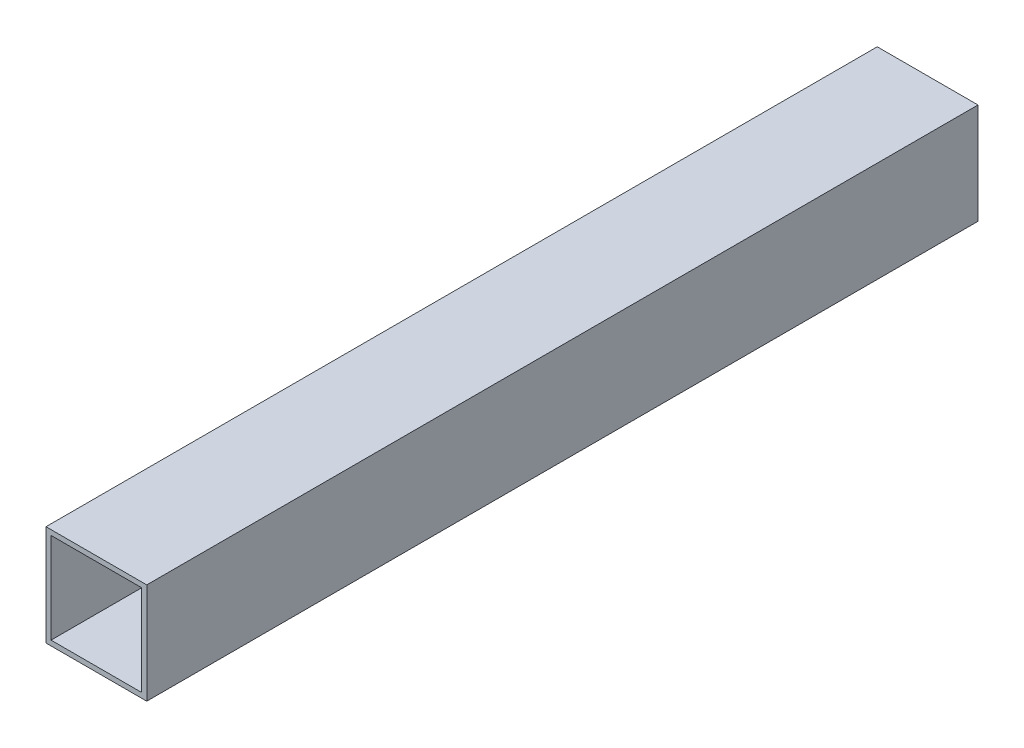
ISO-10303-21;
HEADER;
FILE_DESCRIPTION(('STEP AP214'),'2;1');
FILE_NAME('part.step','',(''),(''),'','','');
FILE_SCHEMA(('AUTOMOTIVE_DESIGN { 1 0 10303 214 1 1 1 1 }'));
ENDSEC;
DATA;
#1=APPLICATION_CONTEXT('core data for automotive mechanical design processes');
#2=APPLICATION_PROTOCOL_DEFINITION('international standard','automotive_design',2000,#1);
#3=PRODUCT_CONTEXT('',#1,'mechanical');
#4=PRODUCT('Part','Part','',(#3));
#5=PRODUCT_RELATED_PRODUCT_CATEGORY('part','',(#4));
#6=PRODUCT_DEFINITION_FORMATION('','',#4);
#7=PRODUCT_DEFINITION_CONTEXT('part definition',#1,'design');
#8=PRODUCT_DEFINITION('design','',#6,#7);
#9=PRODUCT_DEFINITION_SHAPE('','',#8);
#10=(LENGTH_UNIT() NAMED_UNIT(*) SI_UNIT(.MILLI.,.METRE.));
#11=(NAMED_UNIT(*) PLANE_ANGLE_UNIT() SI_UNIT($,.RADIAN.));
#12=(NAMED_UNIT(*) SI_UNIT($,.STERADIAN.) SOLID_ANGLE_UNIT());
#13=UNCERTAINTY_MEASURE_WITH_UNIT(LENGTH_MEASURE(1.E-05),#10,'distance_accuracy_value','');
#14=(GEOMETRIC_REPRESENTATION_CONTEXT(3) GLOBAL_UNCERTAINTY_ASSIGNED_CONTEXT((#13)) GLOBAL_UNIT_ASSIGNED_CONTEXT((#10,
#11,#12)) REPRESENTATION_CONTEXT('',''));
#15=CARTESIAN_POINT('',(0.,0.,0.));
#16=DIRECTION('',(0.,0.,1.));
#17=DIRECTION('',(1.,0.,0.));
#18=AXIS2_PLACEMENT_3D('',#15,#16,#17);
#19=CARTESIAN_POINT('',(-20.,-20.,330.));
#20=DIRECTION('',(0.,0.,1.));
#21=DIRECTION('',(1.,0.,0.));
#22=AXIS2_PLACEMENT_3D('',#19,#20,#21);
#23=PLANE('',#22);
#24=DIRECTION('',(0.,-1.,0.));
#25=VECTOR('',#24,1.);
#26=CARTESIAN_POINT('',(-20.,-20.,330.));
#27=LINE('',#26,#25);
#28=CARTESIAN_POINT('',(-20.,20.,330.));
#29=VERTEX_POINT('',#28);
#30=CARTESIAN_POINT('',(-20.,-20.,330.));
#31=VERTEX_POINT('',#30);
#32=EDGE_CURVE('E155',#29,#31,#27,.T.);
#33=ORIENTED_EDGE('',*,*,#32,.T.);
#34=DIRECTION('',(1.,0.,0.));
#35=VECTOR('',#34,1.);
#36=CARTESIAN_POINT('',(20.,-20.,330.));
#37=LINE('',#36,#35);
#38=CARTESIAN_POINT('',(20.,-20.,330.));
#39=VERTEX_POINT('',#38);
#40=EDGE_CURVE('E158',#31,#39,#37,.T.);
#41=ORIENTED_EDGE('',*,*,#40,.T.);
#42=DIRECTION('',(0.,1.,0.));
#43=VECTOR('',#42,1.);
#44=CARTESIAN_POINT('',(20.,-20.,330.));
#45=LINE('',#44,#43);
#46=CARTESIAN_POINT('',(20.,20.,330.));
#47=VERTEX_POINT('',#46);
#48=EDGE_CURVE('E161',#39,#47,#45,.T.);
#49=ORIENTED_EDGE('',*,*,#48,.T.);
#50=DIRECTION('',(-1.,0.,0.));
#51=VECTOR('',#50,1.);
#52=CARTESIAN_POINT('',(20.,20.,330.));
#53=LINE('',#52,#51);
#54=EDGE_CURVE('E163',#47,#29,#53,.T.);
#55=ORIENTED_EDGE('',*,*,#54,.T.);
#56=EDGE_LOOP('',(#33,#41,#49,#55));
#57=FACE_BOUND('',#56,.T.);
#58=DIRECTION('',(1.,0.,0.));
#59=VECTOR('',#58,1.);
#60=CARTESIAN_POINT('',(20.,-18.,330.));
#61=LINE('',#60,#59);
#62=CARTESIAN_POINT('',(-18.,-18.,330.));
#63=VERTEX_POINT('',#62);
#64=CARTESIAN_POINT('',(18.,-18.,330.));
#65=VERTEX_POINT('',#64);
#66=EDGE_CURVE('E127',#63,#65,#61,.T.);
#67=ORIENTED_EDGE('',*,*,#66,.F.);
#68=DIRECTION('',(0.,-1.,0.));
#69=VECTOR('',#68,1.);
#70=CARTESIAN_POINT('',(-18.,-20.,330.));
#71=LINE('',#70,#69);
#72=CARTESIAN_POINT('',(-18.,18.,330.));
#73=VERTEX_POINT('',#72);
#74=EDGE_CURVE('E119',#73,#63,#71,.T.);
#75=ORIENTED_EDGE('',*,*,#74,.F.);
#76=DIRECTION('',(-1.,0.,0.));
#77=VECTOR('',#76,1.);
#78=CARTESIAN_POINT('',(20.,18.,330.));
#79=LINE('',#78,#77);
#80=CARTESIAN_POINT('',(18.,18.,330.));
#81=VERTEX_POINT('',#80);
#82=EDGE_CURVE('E141',#81,#73,#79,.T.);
#83=ORIENTED_EDGE('',*,*,#82,.F.);
#84=DIRECTION('',(0.,1.,0.));
#85=VECTOR('',#84,1.);
#86=CARTESIAN_POINT('',(18.,-20.,330.));
#87=LINE('',#86,#85);
#88=EDGE_CURVE('E139',#65,#81,#87,.T.);
#89=ORIENTED_EDGE('',*,*,#88,.F.);
#90=EDGE_LOOP('',(#67,#75,#83,#89));
#91=FACE_BOUND('',#90,.T.);
#92=ADVANCED_FACE('F54',(#57,#91),#23,.T.);
#93=CARTESIAN_POINT('',(-20.,-20.,0.));
#94=DIRECTION('',(0.,0.,1.));
#95=DIRECTION('',(1.,0.,0.));
#96=AXIS2_PLACEMENT_3D('',#93,#94,#95);
#97=PLANE('',#96);
#98=DIRECTION('',(0.,-1.,0.));
#99=VECTOR('',#98,1.);
#100=CARTESIAN_POINT('',(-20.,-20.,0.));
#101=LINE('',#100,#99);
#102=CARTESIAN_POINT('',(-20.,20.,0.));
#103=VERTEX_POINT('',#102);
#104=CARTESIAN_POINT('',(-20.,-20.,0.));
#105=VERTEX_POINT('',#104);
#106=EDGE_CURVE('E135',#103,#105,#101,.T.);
#107=ORIENTED_EDGE('',*,*,#106,.F.);
#108=DIRECTION('',(-1.,0.,0.));
#109=VECTOR('',#108,1.);
#110=CARTESIAN_POINT('',(20.,20.,0.));
#111=LINE('',#110,#109);
#112=CARTESIAN_POINT('',(20.,20.,0.));
#113=VERTEX_POINT('',#112);
#114=EDGE_CURVE('E159',#113,#103,#111,.T.);
#115=ORIENTED_EDGE('',*,*,#114,.F.);
#116=DIRECTION('',(0.,1.,0.));
#117=VECTOR('',#116,1.);
#118=CARTESIAN_POINT('',(20.,-20.,0.));
#119=LINE('',#118,#117);
#120=CARTESIAN_POINT('',(20.,-20.,0.));
#121=VERTEX_POINT('',#120);
#122=EDGE_CURVE('E170',#121,#113,#119,.T.);
#123=ORIENTED_EDGE('',*,*,#122,.F.);
#124=DIRECTION('',(1.,0.,0.));
#125=VECTOR('',#124,1.);
#126=CARTESIAN_POINT('',(20.,-20.,0.));
#127=LINE('',#126,#125);
#128=EDGE_CURVE('E168',#105,#121,#127,.T.);
#129=ORIENTED_EDGE('',*,*,#128,.F.);
#130=EDGE_LOOP('',(#107,#115,#123,#129));
#131=FACE_BOUND('',#130,.T.);
#132=DIRECTION('',(0.,-1.,0.));
#133=VECTOR('',#132,1.);
#134=CARTESIAN_POINT('',(-18.,-20.,0.));
#135=LINE('',#134,#133);
#136=CARTESIAN_POINT('',(-18.,18.,0.));
#137=VERTEX_POINT('',#136);
#138=CARTESIAN_POINT('',(-18.,-18.,0.));
#139=VERTEX_POINT('',#138);
#140=EDGE_CURVE('E77',#137,#139,#135,.T.);
#141=ORIENTED_EDGE('',*,*,#140,.T.);
#142=DIRECTION('',(1.,0.,0.));
#143=VECTOR('',#142,1.);
#144=CARTESIAN_POINT('',(20.,-18.,0.));
#145=LINE('',#144,#143);
#146=CARTESIAN_POINT('',(18.,-18.,0.));
#147=VERTEX_POINT('',#146);
#148=EDGE_CURVE('E134',#139,#147,#145,.T.);
#149=ORIENTED_EDGE('',*,*,#148,.T.);
#150=DIRECTION('',(0.,1.,0.));
#151=VECTOR('',#150,1.);
#152=CARTESIAN_POINT('',(18.,-20.,0.));
#153=LINE('',#152,#151);
#154=CARTESIAN_POINT('',(18.,18.,0.));
#155=VERTEX_POINT('',#154);
#156=EDGE_CURVE('E147',#147,#155,#153,.T.);
#157=ORIENTED_EDGE('',*,*,#156,.T.);
#158=DIRECTION('',(-1.,0.,0.));
#159=VECTOR('',#158,1.);
#160=CARTESIAN_POINT('',(20.,18.,0.));
#161=LINE('',#160,#159);
#162=EDGE_CURVE('E128',#155,#137,#161,.T.);
#163=ORIENTED_EDGE('',*,*,#162,.T.);
#164=EDGE_LOOP('',(#141,#149,#157,#163));
#165=FACE_BOUND('',#164,.T.);
#166=ADVANCED_FACE('F188',(#131,#165),#97,.F.);
#167=CARTESIAN_POINT('',(-20.,-20.,330.));
#168=DIRECTION('',(1.,0.,0.));
#169=DIRECTION('',(0.,0.,-1.));
#170=AXIS2_PLACEMENT_3D('',#167,#168,#169);
#171=PLANE('',#170);
#172=ORIENTED_EDGE('',*,*,#106,.T.);
#173=DIRECTION('',(0.,0.,-1.));
#174=VECTOR('',#173,1.);
#175=CARTESIAN_POINT('',(-20.,-20.,330.));
#176=LINE('',#175,#174);
#177=EDGE_CURVE('E12',#31,#105,#176,.T.);
#178=ORIENTED_EDGE('',*,*,#177,.F.);
#179=ORIENTED_EDGE('',*,*,#32,.F.);
#180=DIRECTION('',(0.,0.,-1.));
#181=VECTOR('',#180,1.);
#182=CARTESIAN_POINT('',(-20.,20.,330.));
#183=LINE('',#182,#181);
#184=EDGE_CURVE('E165',#29,#103,#183,.T.);
#185=ORIENTED_EDGE('',*,*,#184,.T.);
#186=EDGE_LOOP('',(#172,#178,#179,#185));
#187=FACE_BOUND('',#186,.T.);
#188=ADVANCED_FACE('F56',(#187),#171,.F.);
#189=CARTESIAN_POINT('',(20.,-20.,330.));
#190=DIRECTION('',(0.,1.,0.));
#191=DIRECTION('',(-1.,0.,0.));
#192=AXIS2_PLACEMENT_3D('',#189,#190,#191);
#193=PLANE('',#192);
#194=ORIENTED_EDGE('',*,*,#128,.T.);
#195=DIRECTION('',(0.,0.,-1.));
#196=VECTOR('',#195,1.);
#197=CARTESIAN_POINT('',(20.,-20.,330.));
#198=LINE('',#197,#196);
#199=EDGE_CURVE('E62',#39,#121,#198,.T.);
#200=ORIENTED_EDGE('',*,*,#199,.F.);
#201=ORIENTED_EDGE('',*,*,#40,.F.);
#202=ORIENTED_EDGE('',*,*,#177,.T.);
#203=EDGE_LOOP('',(#194,#200,#201,#202));
#204=FACE_BOUND('',#203,.T.);
#205=ADVANCED_FACE('F198',(#204),#193,.F.);
#206=CARTESIAN_POINT('',(20.,-20.,330.));
#207=DIRECTION('',(-1.,0.,0.));
#208=DIRECTION('',(0.,0.,1.));
#209=AXIS2_PLACEMENT_3D('',#206,#207,#208);
#210=PLANE('',#209);
#211=ORIENTED_EDGE('',*,*,#122,.T.);
#212=DIRECTION('',(0.,0.,-1.));
#213=VECTOR('',#212,1.);
#214=CARTESIAN_POINT('',(20.,20.,330.));
#215=LINE('',#214,#213);
#216=EDGE_CURVE('E175',#47,#113,#215,.T.);
#217=ORIENTED_EDGE('',*,*,#216,.F.);
#218=ORIENTED_EDGE('',*,*,#48,.F.);
#219=ORIENTED_EDGE('',*,*,#199,.T.);
#220=EDGE_LOOP('',(#211,#217,#218,#219));
#221=FACE_BOUND('',#220,.T.);
#222=ADVANCED_FACE('F182',(#221),#210,.F.);
#223=CARTESIAN_POINT('',(20.,20.,330.));
#224=DIRECTION('',(0.,-1.,0.));
#225=DIRECTION('',(1.,0.,0.));
#226=AXIS2_PLACEMENT_3D('',#223,#224,#225);
#227=PLANE('',#226);
#228=ORIENTED_EDGE('',*,*,#114,.T.);
#229=ORIENTED_EDGE('',*,*,#184,.F.);
#230=ORIENTED_EDGE('',*,*,#54,.F.);
#231=ORIENTED_EDGE('',*,*,#216,.T.);
#232=EDGE_LOOP('',(#228,#229,#230,#231));
#233=FACE_BOUND('',#232,.T.);
#234=ADVANCED_FACE('F192',(#233),#227,.F.);
#235=CARTESIAN_POINT('',(-18.,-20.,330.));
#236=DIRECTION('',(1.,0.,0.));
#237=DIRECTION('',(0.,0.,-1.));
#238=AXIS2_PLACEMENT_3D('',#235,#236,#237);
#239=PLANE('',#238);
#240=ORIENTED_EDGE('',*,*,#140,.F.);
#241=DIRECTION('',(0.,0.,-1.));
#242=VECTOR('',#241,1.);
#243=CARTESIAN_POINT('',(-18.,18.,330.));
#244=LINE('',#243,#242);
#245=EDGE_CURVE('E123',#73,#137,#244,.T.);
#246=ORIENTED_EDGE('',*,*,#245,.F.);
#247=ORIENTED_EDGE('',*,*,#74,.T.);
#248=DIRECTION('',(0.,0.,-1.));
#249=VECTOR('',#248,1.);
#250=CARTESIAN_POINT('',(-18.,-18.,330.));
#251=LINE('',#250,#249);
#252=EDGE_CURVE('E122',#63,#139,#251,.T.);
#253=ORIENTED_EDGE('',*,*,#252,.T.);
#254=EDGE_LOOP('',(#240,#246,#247,#253));
#255=FACE_BOUND('',#254,.T.);
#256=ADVANCED_FACE('F121',(#255),#239,.T.);
#257=CARTESIAN_POINT('',(20.,-18.,330.));
#258=DIRECTION('',(0.,1.,0.));
#259=DIRECTION('',(-1.,0.,0.));
#260=AXIS2_PLACEMENT_3D('',#257,#258,#259);
#261=PLANE('',#260);
#262=ORIENTED_EDGE('',*,*,#148,.F.);
#263=ORIENTED_EDGE('',*,*,#252,.F.);
#264=ORIENTED_EDGE('',*,*,#66,.T.);
#265=DIRECTION('',(0.,0.,-1.));
#266=VECTOR('',#265,1.);
#267=CARTESIAN_POINT('',(18.,-18.,330.));
#268=LINE('',#267,#266);
#269=EDGE_CURVE('E136',#65,#147,#268,.T.);
#270=ORIENTED_EDGE('',*,*,#269,.T.);
#271=EDGE_LOOP('',(#262,#263,#264,#270));
#272=FACE_BOUND('',#271,.T.);
#273=ADVANCED_FACE('F131',(#272),#261,.T.);
#274=CARTESIAN_POINT('',(18.,-20.,330.));
#275=DIRECTION('',(-1.,0.,0.));
#276=DIRECTION('',(0.,0.,1.));
#277=AXIS2_PLACEMENT_3D('',#274,#275,#276);
#278=PLANE('',#277);
#279=ORIENTED_EDGE('',*,*,#156,.F.);
#280=ORIENTED_EDGE('',*,*,#269,.F.);
#281=ORIENTED_EDGE('',*,*,#88,.T.);
#282=DIRECTION('',(0.,0.,-1.));
#283=VECTOR('',#282,1.);
#284=CARTESIAN_POINT('',(18.,18.,330.));
#285=LINE('',#284,#283);
#286=EDGE_CURVE('E69',#81,#155,#285,.T.);
#287=ORIENTED_EDGE('',*,*,#286,.T.);
#288=EDGE_LOOP('',(#279,#280,#281,#287));
#289=FACE_BOUND('',#288,.T.);
#290=ADVANCED_FACE('F221',(#289),#278,.T.);
#291=CARTESIAN_POINT('',(20.,18.,330.));
#292=DIRECTION('',(0.,-1.,0.));
#293=DIRECTION('',(1.,0.,0.));
#294=AXIS2_PLACEMENT_3D('',#291,#292,#293);
#295=PLANE('',#294);
#296=ORIENTED_EDGE('',*,*,#162,.F.);
#297=ORIENTED_EDGE('',*,*,#286,.F.);
#298=ORIENTED_EDGE('',*,*,#82,.T.);
#299=ORIENTED_EDGE('',*,*,#245,.T.);
#300=EDGE_LOOP('',(#296,#297,#298,#299));
#301=FACE_BOUND('',#300,.T.);
#302=ADVANCED_FACE('F225',(#301),#295,.T.);
#303=CLOSED_SHELL('',(#92,#166,#188,#205,#222,#234,#256,#273,#290,#302));
#304=MANIFOLD_SOLID_BREP('B2',#303);
#305=ADVANCED_BREP_SHAPE_REPRESENTATION('',(#18,#304),#14);
#306=SHAPE_DEFINITION_REPRESENTATION(#9,#305);
ENDSEC;
END-ISO-10303-21;
